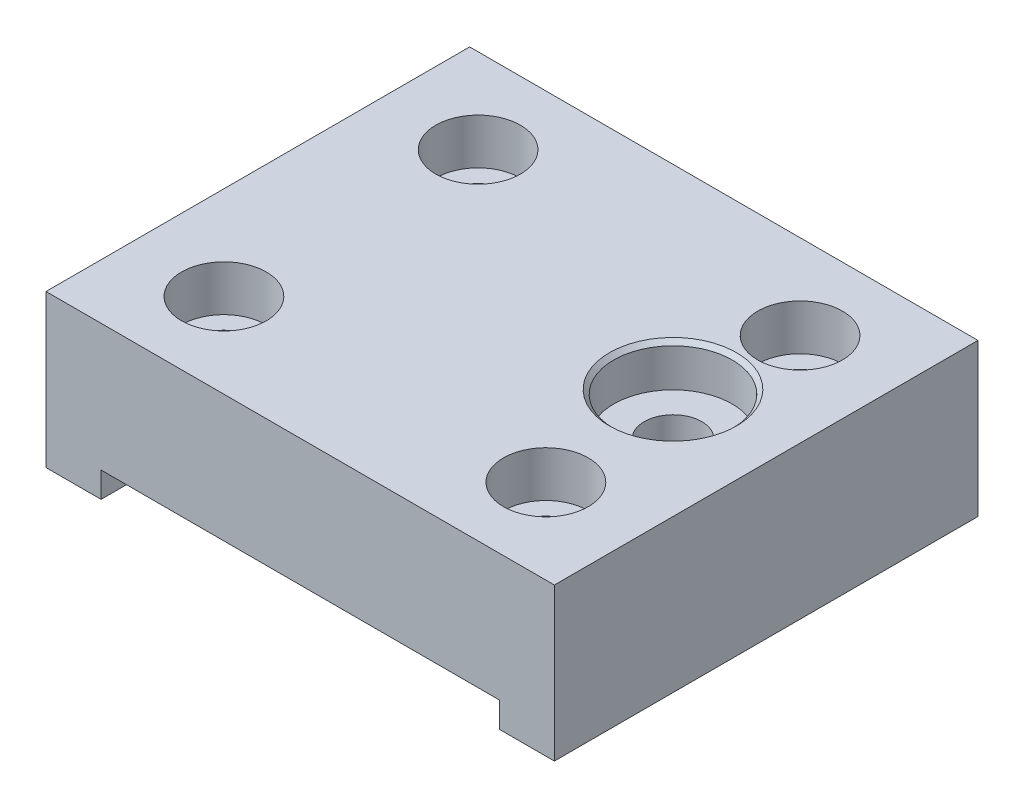
ISO-10303-21;
HEADER;
FILE_DESCRIPTION(('STEP AP214'),'2;1');
FILE_NAME('part.step','',(''),(''),'','','');
FILE_SCHEMA(('AUTOMOTIVE_DESIGN { 1 0 10303 214 1 1 1 1 }'));
ENDSEC;
DATA;
#1=APPLICATION_CONTEXT('core data for automotive mechanical design processes');
#2=APPLICATION_PROTOCOL_DEFINITION('international standard','automotive_design',2000,#1);
#3=PRODUCT_CONTEXT('',#1,'mechanical');
#4=PRODUCT('Part','Part','',(#3));
#5=PRODUCT_RELATED_PRODUCT_CATEGORY('part','',(#4));
#6=PRODUCT_DEFINITION_FORMATION('','',#4);
#7=PRODUCT_DEFINITION_CONTEXT('part definition',#1,'design');
#8=PRODUCT_DEFINITION('design','',#6,#7);
#9=PRODUCT_DEFINITION_SHAPE('','',#8);
#10=(LENGTH_UNIT() NAMED_UNIT(*) SI_UNIT(.MILLI.,.METRE.));
#11=(NAMED_UNIT(*) PLANE_ANGLE_UNIT() SI_UNIT($,.RADIAN.));
#12=(NAMED_UNIT(*) SI_UNIT($,.STERADIAN.) SOLID_ANGLE_UNIT());
#13=UNCERTAINTY_MEASURE_WITH_UNIT(LENGTH_MEASURE(1.E-05),#10,'distance_accuracy_value','');
#14=(GEOMETRIC_REPRESENTATION_CONTEXT(3) GLOBAL_UNCERTAINTY_ASSIGNED_CONTEXT((#13)) GLOBAL_UNIT_ASSIGNED_CONTEXT((#10,
#11,#12)) REPRESENTATION_CONTEXT('',''));
#15=CARTESIAN_POINT('',(0.,0.,0.));
#16=DIRECTION('',(0.,0.,1.));
#17=DIRECTION('',(1.,0.,0.));
#18=AXIS2_PLACEMENT_3D('',#15,#16,#17);
#19=CARTESIAN_POINT('',(17.,9.,-2.));
#20=DIRECTION('',(0.,1.,0.));
#21=DIRECTION('',(0.,0.,1.));
#22=AXIS2_PLACEMENT_3D('',#19,#20,#21);
#23=CYLINDRICAL_SURFACE('',#22,3.4);
#24=CARTESIAN_POINT('',(17.,-6.,-2.));
#25=DIRECTION('',(0.,1.,0.));
#26=DIRECTION('',(0.,0.,1.));
#27=AXIS2_PLACEMENT_3D('',#24,#25,#26);
#28=CIRCLE('',#27,3.4);
#29=CARTESIAN_POINT('',(17.,-6.,1.39999999999999));
#30=VERTEX_POINT('',#29);
#31=EDGE_CURVE('E229',#30,#30,#28,.T.);
#32=ORIENTED_EDGE('',*,*,#31,.F.);
#33=EDGE_LOOP('',(#32));
#34=FACE_BOUND('',#33,.T.);
#35=CARTESIAN_POINT('',(17.,4.,-2.));
#36=DIRECTION('',(0.,1.,0.));
#37=DIRECTION('',(0.,0.,1.));
#38=AXIS2_PLACEMENT_3D('',#35,#36,#37);
#39=CIRCLE('',#38,3.4);
#40=CARTESIAN_POINT('',(17.,4.,1.39999999999999));
#41=VERTEX_POINT('',#40);
#42=EDGE_CURVE('E234',#41,#41,#39,.F.);
#43=ORIENTED_EDGE('',*,*,#42,.F.);
#44=EDGE_LOOP('',(#43));
#45=FACE_BOUND('',#44,.T.);
#46=ADVANCED_FACE('F49',(#34,#45),#23,.F.);
#47=CARTESIAN_POINT('',(0.,-9.,0.));
#48=DIRECTION('',(0.,1.,0.));
#49=DIRECTION('',(0.,0.,1.));
#50=AXIS2_PLACEMENT_3D('',#47,#48,#49);
#51=PLANE('',#50);
#52=DIRECTION('',(-1.,0.,0.));
#53=VECTOR('',#52,1.);
#54=CARTESIAN_POINT('',(-30.,-9.,-25.));
#55=LINE('',#54,#53);
#56=CARTESIAN_POINT('',(-23.5,-9.,-25.));
#57=VERTEX_POINT('',#56);
#58=CARTESIAN_POINT('',(-30.,-9.,-25.));
#59=VERTEX_POINT('',#58);
#60=EDGE_CURVE('E178',#57,#59,#55,.T.);
#61=ORIENTED_EDGE('',*,*,#60,.F.);
#62=DIRECTION('',(0.,0.,1.));
#63=VECTOR('',#62,1.);
#64=CARTESIAN_POINT('',(-23.5,-9.,0.));
#65=LINE('',#64,#63);
#66=CARTESIAN_POINT('',(-23.5,-9.,25.));
#67=VERTEX_POINT('',#66);
#68=EDGE_CURVE('E203',#57,#67,#65,.T.);
#69=ORIENTED_EDGE('',*,*,#68,.T.);
#70=DIRECTION('',(1.,0.,0.));
#71=VECTOR('',#70,1.);
#72=CARTESIAN_POINT('',(-30.,-9.,25.));
#73=LINE('',#72,#71);
#74=CARTESIAN_POINT('',(-30.,-9.,25.));
#75=VERTEX_POINT('',#74);
#76=EDGE_CURVE('E166',#75,#67,#73,.T.);
#77=ORIENTED_EDGE('',*,*,#76,.F.);
#78=DIRECTION('',(0.,0.,1.));
#79=VECTOR('',#78,1.);
#80=CARTESIAN_POINT('',(-30.,-9.,-25.));
#81=LINE('',#80,#79);
#82=EDGE_CURVE('E181',#59,#75,#81,.T.);
#83=ORIENTED_EDGE('',*,*,#82,.F.);
#84=EDGE_LOOP('',(#61,#69,#77,#83));
#85=FACE_BOUND('',#84,.T.);
#86=ADVANCED_FACE('F254',(#85),#51,.F.);
#87=CARTESIAN_POINT('',(30.,9.,-25.));
#88=DIRECTION('',(-1.,0.,0.));
#89=DIRECTION('',(0.,0.,1.));
#90=AXIS2_PLACEMENT_3D('',#87,#88,#89);
#91=PLANE('',#90);
#92=DIRECTION('',(0.,0.,-1.));
#93=VECTOR('',#92,1.);
#94=CARTESIAN_POINT('',(30.,-9.,-25.));
#95=LINE('',#94,#93);
#96=CARTESIAN_POINT('',(30.,-9.,25.));
#97=VERTEX_POINT('',#96);
#98=CARTESIAN_POINT('',(30.,-9.,-25.));
#99=VERTEX_POINT('',#98);
#100=EDGE_CURVE('E161',#97,#99,#95,.T.);
#101=ORIENTED_EDGE('',*,*,#100,.T.);
#102=DIRECTION('',(0.,-1.,0.));
#103=VECTOR('',#102,1.);
#104=CARTESIAN_POINT('',(30.,9.,-25.));
#105=LINE('',#104,#103);
#106=CARTESIAN_POINT('',(30.,9.,-25.));
#107=VERTEX_POINT('',#106);
#108=EDGE_CURVE('E197',#107,#99,#105,.T.);
#109=ORIENTED_EDGE('',*,*,#108,.F.);
#110=DIRECTION('',(0.,0.,-1.));
#111=VECTOR('',#110,1.);
#112=CARTESIAN_POINT('',(30.,9.,-25.));
#113=LINE('',#112,#111);
#114=CARTESIAN_POINT('',(30.,9.,25.));
#115=VERTEX_POINT('',#114);
#116=EDGE_CURVE('E163',#115,#107,#113,.T.);
#117=ORIENTED_EDGE('',*,*,#116,.F.);
#118=DIRECTION('',(0.,-1.,0.));
#119=VECTOR('',#118,1.);
#120=CARTESIAN_POINT('',(30.,9.,25.));
#121=LINE('',#120,#119);
#122=EDGE_CURVE('E174',#115,#97,#121,.T.);
#123=ORIENTED_EDGE('',*,*,#122,.T.);
#124=EDGE_LOOP('',(#101,#109,#117,#123));
#125=FACE_BOUND('',#124,.T.);
#126=ADVANCED_FACE('F260',(#125),#91,.F.);
#127=CARTESIAN_POINT('',(-30.,9.,-25.));
#128=DIRECTION('',(0.,0.,1.));
#129=DIRECTION('',(1.,0.,0.));
#130=AXIS2_PLACEMENT_3D('',#127,#128,#129);
#131=PLANE('',#130);
#132=DIRECTION('',(-1.,0.,0.));
#133=VECTOR('',#132,1.);
#134=CARTESIAN_POINT('',(-23.5,-6.,-25.));
#135=LINE('',#134,#133);
#136=CARTESIAN_POINT('',(23.5,-6.,-25.));
#137=VERTEX_POINT('',#136);
#138=CARTESIAN_POINT('',(-23.5,-6.,-25.));
#139=VERTEX_POINT('',#138);
#140=EDGE_CURVE('E133',#137,#139,#135,.T.);
#141=ORIENTED_EDGE('',*,*,#140,.T.);
#142=DIRECTION('',(0.,-1.,0.));
#143=VECTOR('',#142,1.);
#144=CARTESIAN_POINT('',(-23.5,-6.,-25.));
#145=LINE('',#144,#143);
#146=EDGE_CURVE('E145',#139,#57,#145,.T.);
#147=ORIENTED_EDGE('',*,*,#146,.T.);
#148=ORIENTED_EDGE('',*,*,#60,.T.);
#149=DIRECTION('',(0.,-1.,0.));
#150=VECTOR('',#149,1.);
#151=CARTESIAN_POINT('',(-30.,9.,-25.));
#152=LINE('',#151,#150);
#153=CARTESIAN_POINT('',(-30.,9.,-25.));
#154=VERTEX_POINT('',#153);
#155=EDGE_CURVE('E193',#154,#59,#152,.T.);
#156=ORIENTED_EDGE('',*,*,#155,.F.);
#157=DIRECTION('',(-1.,0.,0.));
#158=VECTOR('',#157,1.);
#159=CARTESIAN_POINT('',(-30.,9.,-25.));
#160=LINE('',#159,#158);
#161=EDGE_CURVE('E104',#107,#154,#160,.T.);
#162=ORIENTED_EDGE('',*,*,#161,.F.);
#163=ORIENTED_EDGE('',*,*,#108,.T.);
#164=CARTESIAN_POINT('',(23.5,-9.,-25.));
#165=VERTEX_POINT('',#164);
#166=EDGE_CURVE('E143',#99,#165,#55,.T.);
#167=ORIENTED_EDGE('',*,*,#166,.T.);
#168=DIRECTION('',(0.,1.,0.));
#169=VECTOR('',#168,1.);
#170=CARTESIAN_POINT('',(23.5,-6.,-25.));
#171=LINE('',#170,#169);
#172=EDGE_CURVE('E66',#165,#137,#171,.T.);
#173=ORIENTED_EDGE('',*,*,#172,.T.);
#174=EDGE_LOOP('',(#141,#147,#148,#156,#162,#163,#167,#173));
#175=FACE_BOUND('',#174,.T.);
#176=ADVANCED_FACE('F142',(#175),#131,.F.);
#177=CARTESIAN_POINT('',(-30.,9.,-25.));
#178=DIRECTION('',(1.,0.,0.));
#179=DIRECTION('',(0.,0.,-1.));
#180=AXIS2_PLACEMENT_3D('',#177,#178,#179);
#181=PLANE('',#180);
#182=ORIENTED_EDGE('',*,*,#82,.T.);
#183=DIRECTION('',(0.,-1.,0.));
#184=VECTOR('',#183,1.);
#185=CARTESIAN_POINT('',(-30.,9.,25.));
#186=LINE('',#185,#184);
#187=CARTESIAN_POINT('',(-30.,9.,25.));
#188=VERTEX_POINT('',#187);
#189=EDGE_CURVE('E189',#188,#75,#186,.T.);
#190=ORIENTED_EDGE('',*,*,#189,.F.);
#191=DIRECTION('',(0.,0.,1.));
#192=VECTOR('',#191,1.);
#193=CARTESIAN_POINT('',(-30.,9.,-25.));
#194=LINE('',#193,#192);
#195=EDGE_CURVE('E169',#154,#188,#194,.T.);
#196=ORIENTED_EDGE('',*,*,#195,.F.);
#197=ORIENTED_EDGE('',*,*,#155,.T.);
#198=EDGE_LOOP('',(#182,#190,#196,#197));
#199=FACE_BOUND('',#198,.T.);
#200=ADVANCED_FACE('F334',(#199),#181,.F.);
#201=CARTESIAN_POINT('',(-30.,9.,25.));
#202=DIRECTION('',(0.,0.,-1.));
#203=DIRECTION('',(-1.,0.,0.));
#204=AXIS2_PLACEMENT_3D('',#201,#202,#203);
#205=PLANE('',#204);
#206=ORIENTED_EDGE('',*,*,#76,.T.);
#207=DIRECTION('',(0.,-1.,0.));
#208=VECTOR('',#207,1.);
#209=CARTESIAN_POINT('',(-23.5,-6.,25.));
#210=LINE('',#209,#208);
#211=CARTESIAN_POINT('',(-23.5,-6.,25.));
#212=VERTEX_POINT('',#211);
#213=EDGE_CURVE('E152',#212,#67,#210,.T.);
#214=ORIENTED_EDGE('',*,*,#213,.F.);
#215=DIRECTION('',(-1.,0.,0.));
#216=VECTOR('',#215,1.);
#217=CARTESIAN_POINT('',(-23.5,-6.,25.));
#218=LINE('',#217,#216);
#219=CARTESIAN_POINT('',(23.5,-6.,25.));
#220=VERTEX_POINT('',#219);
#221=EDGE_CURVE('E148',#220,#212,#218,.T.);
#222=ORIENTED_EDGE('',*,*,#221,.F.);
#223=DIRECTION('',(0.,1.,0.));
#224=VECTOR('',#223,1.);
#225=CARTESIAN_POINT('',(23.5,-6.,25.));
#226=LINE('',#225,#224);
#227=CARTESIAN_POINT('',(23.5,-9.,25.));
#228=VERTEX_POINT('',#227);
#229=EDGE_CURVE('E127',#228,#220,#226,.T.);
#230=ORIENTED_EDGE('',*,*,#229,.F.);
#231=EDGE_CURVE('E96',#228,#97,#73,.T.);
#232=ORIENTED_EDGE('',*,*,#231,.T.);
#233=ORIENTED_EDGE('',*,*,#122,.F.);
#234=DIRECTION('',(1.,0.,0.));
#235=VECTOR('',#234,1.);
#236=CARTESIAN_POINT('',(-30.,9.,25.));
#237=LINE('',#236,#235);
#238=EDGE_CURVE('E75',#188,#115,#237,.T.);
#239=ORIENTED_EDGE('',*,*,#238,.F.);
#240=ORIENTED_EDGE('',*,*,#189,.T.);
#241=EDGE_LOOP('',(#206,#214,#222,#230,#232,#233,#239,#240));
#242=FACE_BOUND('',#241,.T.);
#243=ADVANCED_FACE('F327',(#242),#205,.F.);
#244=CARTESIAN_POINT('',(0.,9.,0.));
#245=DIRECTION('',(0.,1.,0.));
#246=DIRECTION('',(0.,0.,1.));
#247=AXIS2_PLACEMENT_3D('',#244,#245,#246);
#248=PLANE('',#247);
#249=CARTESIAN_POINT('',(17.,9.,-2.));
#250=DIRECTION('',(0.,1.,0.));
#251=DIRECTION('',(0.,0.,1.));
#252=AXIS2_PLACEMENT_3D('',#249,#250,#251);
#253=CIRCLE('',#252,7.5);
#254=CARTESIAN_POINT('',(17.,9.,5.5));
#255=VERTEX_POINT('',#254);
#256=EDGE_CURVE('E11',#255,#255,#253,.F.);
#257=ORIENTED_EDGE('',*,*,#256,.T.);
#258=EDGE_LOOP('',(#257));
#259=FACE_BOUND('',#258,.T.);
#260=CARTESIAN_POINT('',(-19.,9.,-15.));
#261=DIRECTION('',(0.,1.,0.));
#262=DIRECTION('',(0.,0.,1.));
#263=AXIS2_PLACEMENT_3D('',#260,#261,#262);
#264=CIRCLE('',#263,4.99999999999999);
#265=CARTESIAN_POINT('',(-19.,9.,-10.));
#266=VERTEX_POINT('',#265);
#267=EDGE_CURVE('E233',#266,#266,#264,.T.);
#268=ORIENTED_EDGE('',*,*,#267,.F.);
#269=EDGE_LOOP('',(#268));
#270=FACE_BOUND('',#269,.T.);
#271=CARTESIAN_POINT('',(19.,9.,-15.));
#272=DIRECTION('',(0.,1.,0.));
#273=DIRECTION('',(0.,0.,1.));
#274=AXIS2_PLACEMENT_3D('',#271,#272,#273);
#275=CIRCLE('',#274,4.99999999999999);
#276=CARTESIAN_POINT('',(19.,9.,-10.));
#277=VERTEX_POINT('',#276);
#278=EDGE_CURVE('E227',#277,#277,#275,.T.);
#279=ORIENTED_EDGE('',*,*,#278,.F.);
#280=EDGE_LOOP('',(#279));
#281=FACE_BOUND('',#280,.T.);
#282=CARTESIAN_POINT('',(19.,9.,15.));
#283=DIRECTION('',(0.,1.,0.));
#284=DIRECTION('',(0.,0.,1.));
#285=AXIS2_PLACEMENT_3D('',#282,#283,#284);
#286=CIRCLE('',#285,4.99999999999999);
#287=CARTESIAN_POINT('',(19.,9.,20.));
#288=VERTEX_POINT('',#287);
#289=EDGE_CURVE('E221',#288,#288,#286,.T.);
#290=ORIENTED_EDGE('',*,*,#289,.F.);
#291=EDGE_LOOP('',(#290));
#292=FACE_BOUND('',#291,.T.);
#293=CARTESIAN_POINT('',(-19.,9.,15.));
#294=DIRECTION('',(0.,1.,0.));
#295=DIRECTION('',(0.,0.,1.));
#296=AXIS2_PLACEMENT_3D('',#293,#294,#295);
#297=CIRCLE('',#296,4.99999999999999);
#298=CARTESIAN_POINT('',(-19.,9.,20.));
#299=VERTEX_POINT('',#298);
#300=EDGE_CURVE('E215',#299,#299,#297,.T.);
#301=ORIENTED_EDGE('',*,*,#300,.F.);
#302=EDGE_LOOP('',(#301));
#303=FACE_BOUND('',#302,.T.);
#304=ORIENTED_EDGE('',*,*,#116,.T.);
#305=ORIENTED_EDGE('',*,*,#161,.T.);
#306=ORIENTED_EDGE('',*,*,#195,.T.);
#307=ORIENTED_EDGE('',*,*,#238,.T.);
#308=EDGE_LOOP('',(#304,#305,#306,#307));
#309=FACE_BOUND('',#308,.T.);
#310=ADVANCED_FACE('F325',(#259,#270,#281,#292,#303,#309),#248,.T.);
#311=ORIENTED_EDGE('',*,*,#231,.F.);
#312=DIRECTION('',(0.,0.,-1.));
#313=VECTOR('',#312,1.);
#314=CARTESIAN_POINT('',(23.5,-9.,0.));
#315=LINE('',#314,#313);
#316=EDGE_CURVE('E200',#228,#165,#315,.T.);
#317=ORIENTED_EDGE('',*,*,#316,.T.);
#318=ORIENTED_EDGE('',*,*,#166,.F.);
#319=ORIENTED_EDGE('',*,*,#100,.F.);
#320=EDGE_LOOP('',(#311,#317,#318,#319));
#321=FACE_BOUND('',#320,.T.);
#322=ADVANCED_FACE('F263',(#321),#51,.F.);
#323=CARTESIAN_POINT('',(-23.5,-6.,-25.));
#324=DIRECTION('',(-1.,0.,0.));
#325=DIRECTION('',(0.,0.,1.));
#326=AXIS2_PLACEMENT_3D('',#323,#324,#325);
#327=PLANE('',#326);
#328=ORIENTED_EDGE('',*,*,#146,.F.);
#329=DIRECTION('',(0.,0.,1.));
#330=VECTOR('',#329,1.);
#331=CARTESIAN_POINT('',(-23.5,-6.,-25.));
#332=LINE('',#331,#330);
#333=EDGE_CURVE('E132',#139,#212,#332,.T.);
#334=ORIENTED_EDGE('',*,*,#333,.T.);
#335=ORIENTED_EDGE('',*,*,#213,.T.);
#336=ORIENTED_EDGE('',*,*,#68,.F.);
#337=EDGE_LOOP('',(#328,#334,#335,#336));
#338=FACE_BOUND('',#337,.T.);
#339=ADVANCED_FACE('F321',(#338),#327,.F.);
#340=CARTESIAN_POINT('',(23.5,-6.,-25.));
#341=DIRECTION('',(1.,0.,0.));
#342=DIRECTION('',(0.,0.,-1.));
#343=AXIS2_PLACEMENT_3D('',#340,#341,#342);
#344=PLANE('',#343);
#345=ORIENTED_EDGE('',*,*,#229,.T.);
#346=DIRECTION('',(0.,0.,1.));
#347=VECTOR('',#346,1.);
#348=CARTESIAN_POINT('',(23.5,-6.,-25.));
#349=LINE('',#348,#347);
#350=EDGE_CURVE('E124',#137,#220,#349,.T.);
#351=ORIENTED_EDGE('',*,*,#350,.F.);
#352=ORIENTED_EDGE('',*,*,#172,.F.);
#353=ORIENTED_EDGE('',*,*,#316,.F.);
#354=EDGE_LOOP('',(#345,#351,#352,#353));
#355=FACE_BOUND('',#354,.T.);
#356=ADVANCED_FACE('F126',(#355),#344,.F.);
#357=CARTESIAN_POINT('',(-23.5,-6.,-25.));
#358=DIRECTION('',(0.,1.,0.));
#359=DIRECTION('',(0.,0.,1.));
#360=AXIS2_PLACEMENT_3D('',#357,#358,#359);
#361=PLANE('',#360);
#362=ORIENTED_EDGE('',*,*,#31,.T.);
#363=EDGE_LOOP('',(#362));
#364=FACE_BOUND('',#363,.T.);
#365=CARTESIAN_POINT('',(-19.,-6.,-15.));
#366=DIRECTION('',(0.,1.,0.));
#367=DIRECTION('',(0.,0.,1.));
#368=AXIS2_PLACEMENT_3D('',#365,#366,#367);
#369=CIRCLE('',#368,2.75);
#370=CARTESIAN_POINT('',(-19.,-6.,-12.25));
#371=VERTEX_POINT('',#370);
#372=EDGE_CURVE('E223',#371,#371,#369,.T.);
#373=ORIENTED_EDGE('',*,*,#372,.T.);
#374=EDGE_LOOP('',(#373));
#375=FACE_BOUND('',#374,.T.);
#376=CARTESIAN_POINT('',(19.,-6.,-15.));
#377=DIRECTION('',(0.,1.,0.));
#378=DIRECTION('',(0.,0.,1.));
#379=AXIS2_PLACEMENT_3D('',#376,#377,#378);
#380=CIRCLE('',#379,2.75);
#381=CARTESIAN_POINT('',(19.,-6.,-12.25));
#382=VERTEX_POINT('',#381);
#383=EDGE_CURVE('E217',#382,#382,#380,.T.);
#384=ORIENTED_EDGE('',*,*,#383,.T.);
#385=EDGE_LOOP('',(#384));
#386=FACE_BOUND('',#385,.T.);
#387=CARTESIAN_POINT('',(19.,-6.,15.));
#388=DIRECTION('',(0.,1.,0.));
#389=DIRECTION('',(0.,0.,1.));
#390=AXIS2_PLACEMENT_3D('',#387,#388,#389);
#391=CIRCLE('',#390,2.75);
#392=CARTESIAN_POINT('',(19.,-6.,17.75));
#393=VERTEX_POINT('',#392);
#394=EDGE_CURVE('E211',#393,#393,#391,.T.);
#395=ORIENTED_EDGE('',*,*,#394,.T.);
#396=EDGE_LOOP('',(#395));
#397=FACE_BOUND('',#396,.T.);
#398=CARTESIAN_POINT('',(-19.,-6.,15.));
#399=DIRECTION('',(0.,1.,0.));
#400=DIRECTION('',(0.,0.,1.));
#401=AXIS2_PLACEMENT_3D('',#398,#399,#400);
#402=CIRCLE('',#401,2.75);
#403=CARTESIAN_POINT('',(-19.,-6.,17.75));
#404=VERTEX_POINT('',#403);
#405=EDGE_CURVE('E155',#404,#404,#402,.T.);
#406=ORIENTED_EDGE('',*,*,#405,.T.);
#407=EDGE_LOOP('',(#406));
#408=FACE_BOUND('',#407,.T.);
#409=ORIENTED_EDGE('',*,*,#221,.T.);
#410=ORIENTED_EDGE('',*,*,#333,.F.);
#411=ORIENTED_EDGE('',*,*,#140,.F.);
#412=ORIENTED_EDGE('',*,*,#350,.T.);
#413=EDGE_LOOP('',(#409,#410,#411,#412));
#414=FACE_BOUND('',#413,.T.);
#415=ADVANCED_FACE('F136',(#364,#375,#386,#397,#408,#414),#361,.F.);
#416=CARTESIAN_POINT('',(-19.,9.,15.));
#417=DIRECTION('',(0.,1.,0.));
#418=DIRECTION('',(0.,0.,1.));
#419=AXIS2_PLACEMENT_3D('',#416,#417,#418);
#420=CYLINDRICAL_SURFACE('',#419,2.75);
#421=CARTESIAN_POINT('',(-19.,3.6,15.));
#422=DIRECTION('',(0.,1.,0.));
#423=DIRECTION('',(0.,0.,1.));
#424=AXIS2_PLACEMENT_3D('',#421,#422,#423);
#425=CIRCLE('',#424,2.75);
#426=CARTESIAN_POINT('',(-19.,3.6,17.75));
#427=VERTEX_POINT('',#426);
#428=EDGE_CURVE('E210',#427,#427,#425,.T.);
#429=ORIENTED_EDGE('',*,*,#428,.T.);
#430=EDGE_LOOP('',(#429));
#431=FACE_BOUND('',#430,.T.);
#432=ORIENTED_EDGE('',*,*,#405,.F.);
#433=EDGE_LOOP('',(#432));
#434=FACE_BOUND('',#433,.T.);
#435=ADVANCED_FACE('F311',(#431,#434),#420,.F.);
#436=CARTESIAN_POINT('',(-16.25,3.6,15.));
#437=DIRECTION('',(0.,-1.,0.));
#438=DIRECTION('',(0.,0.,-1.));
#439=AXIS2_PLACEMENT_3D('',#436,#437,#438);
#440=PLANE('',#439);
#441=ORIENTED_EDGE('',*,*,#428,.F.);
#442=EDGE_LOOP('',(#441));
#443=FACE_BOUND('',#442,.T.);
#444=CARTESIAN_POINT('',(-19.,3.6,15.));
#445=DIRECTION('',(0.,1.,0.));
#446=DIRECTION('',(0.,0.,1.));
#447=AXIS2_PLACEMENT_3D('',#444,#445,#446);
#448=CIRCLE('',#447,5.);
#449=CARTESIAN_POINT('',(-19.,3.6,20.));
#450=VERTEX_POINT('',#449);
#451=EDGE_CURVE('E608',#450,#450,#448,.T.);
#452=ORIENTED_EDGE('',*,*,#451,.T.);
#453=EDGE_LOOP('',(#452));
#454=FACE_BOUND('',#453,.T.);
#455=ADVANCED_FACE('F307',(#443,#454),#440,.F.);
#456=CARTESIAN_POINT('',(-19.,9.,15.));
#457=DIRECTION('',(0.,1.,0.));
#458=DIRECTION('',(0.,0.,1.));
#459=AXIS2_PLACEMENT_3D('',#456,#457,#458);
#460=CYLINDRICAL_SURFACE('',#459,4.99999999999999);
#461=ORIENTED_EDGE('',*,*,#451,.F.);
#462=EDGE_LOOP('',(#461));
#463=FACE_BOUND('',#462,.T.);
#464=ORIENTED_EDGE('',*,*,#300,.T.);
#465=EDGE_LOOP('',(#464));
#466=FACE_BOUND('',#465,.T.);
#467=ADVANCED_FACE('F303',(#463,#466),#460,.F.);
#468=CARTESIAN_POINT('',(19.,9.,15.));
#469=DIRECTION('',(0.,1.,0.));
#470=DIRECTION('',(0.,0.,1.));
#471=AXIS2_PLACEMENT_3D('',#468,#469,#470);
#472=CYLINDRICAL_SURFACE('',#471,2.75);
#473=CARTESIAN_POINT('',(19.,3.6,15.));
#474=DIRECTION('',(0.,1.,0.));
#475=DIRECTION('',(0.,0.,1.));
#476=AXIS2_PLACEMENT_3D('',#473,#474,#475);
#477=CIRCLE('',#476,2.75);
#478=CARTESIAN_POINT('',(19.,3.6,17.75));
#479=VERTEX_POINT('',#478);
#480=EDGE_CURVE('E216',#479,#479,#477,.T.);
#481=ORIENTED_EDGE('',*,*,#480,.T.);
#482=EDGE_LOOP('',(#481));
#483=FACE_BOUND('',#482,.T.);
#484=ORIENTED_EDGE('',*,*,#394,.F.);
#485=EDGE_LOOP('',(#484));
#486=FACE_BOUND('',#485,.T.);
#487=ADVANCED_FACE('F299',(#483,#486),#472,.F.);
#488=CARTESIAN_POINT('',(21.75,3.6,15.));
#489=DIRECTION('',(0.,-1.,0.));
#490=DIRECTION('',(0.,0.,-1.));
#491=AXIS2_PLACEMENT_3D('',#488,#489,#490);
#492=PLANE('',#491);
#493=ORIENTED_EDGE('',*,*,#480,.F.);
#494=EDGE_LOOP('',(#493));
#495=FACE_BOUND('',#494,.T.);
#496=CARTESIAN_POINT('',(19.,3.6,15.));
#497=DIRECTION('',(0.,1.,0.));
#498=DIRECTION('',(0.,0.,1.));
#499=AXIS2_PLACEMENT_3D('',#496,#497,#498);
#500=CIRCLE('',#499,5.);
#501=CARTESIAN_POINT('',(19.,3.6,20.));
#502=VERTEX_POINT('',#501);
#503=EDGE_CURVE('E598',#502,#502,#500,.T.);
#504=ORIENTED_EDGE('',*,*,#503,.T.);
#505=EDGE_LOOP('',(#504));
#506=FACE_BOUND('',#505,.T.);
#507=ADVANCED_FACE('F295',(#495,#506),#492,.F.);
#508=CARTESIAN_POINT('',(19.,9.,15.));
#509=DIRECTION('',(0.,1.,0.));
#510=DIRECTION('',(0.,0.,1.));
#511=AXIS2_PLACEMENT_3D('',#508,#509,#510);
#512=CYLINDRICAL_SURFACE('',#511,5.);
#513=ORIENTED_EDGE('',*,*,#503,.F.);
#514=EDGE_LOOP('',(#513));
#515=FACE_BOUND('',#514,.T.);
#516=ORIENTED_EDGE('',*,*,#289,.T.);
#517=EDGE_LOOP('',(#516));
#518=FACE_BOUND('',#517,.T.);
#519=ADVANCED_FACE('F291',(#515,#518),#512,.F.);
#520=CARTESIAN_POINT('',(19.,9.,-15.));
#521=DIRECTION('',(0.,1.,0.));
#522=DIRECTION('',(0.,0.,1.));
#523=AXIS2_PLACEMENT_3D('',#520,#521,#522);
#524=CYLINDRICAL_SURFACE('',#523,2.75);
#525=CARTESIAN_POINT('',(19.,3.6,-15.));
#526=DIRECTION('',(0.,1.,0.));
#527=DIRECTION('',(0.,0.,1.));
#528=AXIS2_PLACEMENT_3D('',#525,#526,#527);
#529=CIRCLE('',#528,2.75);
#530=CARTESIAN_POINT('',(19.,3.6,-12.25));
#531=VERTEX_POINT('',#530);
#532=EDGE_CURVE('E222',#531,#531,#529,.T.);
#533=ORIENTED_EDGE('',*,*,#532,.T.);
#534=EDGE_LOOP('',(#533));
#535=FACE_BOUND('',#534,.T.);
#536=ORIENTED_EDGE('',*,*,#383,.F.);
#537=EDGE_LOOP('',(#536));
#538=FACE_BOUND('',#537,.T.);
#539=ADVANCED_FACE('F287',(#535,#538),#524,.F.);
#540=CARTESIAN_POINT('',(21.75,3.6,-15.));
#541=DIRECTION('',(0.,-1.,0.));
#542=DIRECTION('',(0.,0.,-1.));
#543=AXIS2_PLACEMENT_3D('',#540,#541,#542);
#544=PLANE('',#543);
#545=ORIENTED_EDGE('',*,*,#532,.F.);
#546=EDGE_LOOP('',(#545));
#547=FACE_BOUND('',#546,.T.);
#548=CARTESIAN_POINT('',(19.,3.6,-15.));
#549=DIRECTION('',(0.,1.,0.));
#550=DIRECTION('',(0.,0.,1.));
#551=AXIS2_PLACEMENT_3D('',#548,#549,#550);
#552=CIRCLE('',#551,5.);
#553=CARTESIAN_POINT('',(19.,3.6,-10.));
#554=VERTEX_POINT('',#553);
#555=EDGE_CURVE('E588',#554,#554,#552,.T.);
#556=ORIENTED_EDGE('',*,*,#555,.T.);
#557=EDGE_LOOP('',(#556));
#558=FACE_BOUND('',#557,.T.);
#559=ADVANCED_FACE('F283',(#547,#558),#544,.F.);
#560=CARTESIAN_POINT('',(19.,9.,-15.));
#561=DIRECTION('',(0.,1.,0.));
#562=DIRECTION('',(0.,0.,1.));
#563=AXIS2_PLACEMENT_3D('',#560,#561,#562);
#564=CYLINDRICAL_SURFACE('',#563,5.);
#565=ORIENTED_EDGE('',*,*,#555,.F.);
#566=EDGE_LOOP('',(#565));
#567=FACE_BOUND('',#566,.T.);
#568=ORIENTED_EDGE('',*,*,#278,.T.);
#569=EDGE_LOOP('',(#568));
#570=FACE_BOUND('',#569,.T.);
#571=ADVANCED_FACE('F279',(#567,#570),#564,.F.);
#572=CARTESIAN_POINT('',(-19.,9.,-15.));
#573=DIRECTION('',(0.,1.,0.));
#574=DIRECTION('',(0.,0.,1.));
#575=AXIS2_PLACEMENT_3D('',#572,#573,#574);
#576=CYLINDRICAL_SURFACE('',#575,2.75);
#577=CARTESIAN_POINT('',(-19.,3.6,-15.));
#578=DIRECTION('',(0.,1.,0.));
#579=DIRECTION('',(0.,0.,1.));
#580=AXIS2_PLACEMENT_3D('',#577,#578,#579);
#581=CIRCLE('',#580,2.75);
#582=CARTESIAN_POINT('',(-19.,3.6,-12.25));
#583=VERTEX_POINT('',#582);
#584=EDGE_CURVE('E228',#583,#583,#581,.T.);
#585=ORIENTED_EDGE('',*,*,#584,.T.);
#586=EDGE_LOOP('',(#585));
#587=FACE_BOUND('',#586,.T.);
#588=ORIENTED_EDGE('',*,*,#372,.F.);
#589=EDGE_LOOP('',(#588));
#590=FACE_BOUND('',#589,.T.);
#591=ADVANCED_FACE('F275',(#587,#590),#576,.F.);
#592=CARTESIAN_POINT('',(-16.25,3.6,-15.));
#593=DIRECTION('',(0.,-1.,0.));
#594=DIRECTION('',(0.,0.,-1.));
#595=AXIS2_PLACEMENT_3D('',#592,#593,#594);
#596=PLANE('',#595);
#597=ORIENTED_EDGE('',*,*,#584,.F.);
#598=EDGE_LOOP('',(#597));
#599=FACE_BOUND('',#598,.T.);
#600=CARTESIAN_POINT('',(-19.,3.6,-15.));
#601=DIRECTION('',(0.,1.,0.));
#602=DIRECTION('',(0.,0.,1.));
#603=AXIS2_PLACEMENT_3D('',#600,#601,#602);
#604=CIRCLE('',#603,5.);
#605=CARTESIAN_POINT('',(-19.,3.6,-10.));
#606=VERTEX_POINT('',#605);
#607=EDGE_CURVE('E578',#606,#606,#604,.T.);
#608=ORIENTED_EDGE('',*,*,#607,.T.);
#609=EDGE_LOOP('',(#608));
#610=FACE_BOUND('',#609,.T.);
#611=ADVANCED_FACE('F271',(#599,#610),#596,.F.);
#612=CARTESIAN_POINT('',(-19.,9.,-15.));
#613=DIRECTION('',(0.,1.,0.));
#614=DIRECTION('',(0.,0.,1.));
#615=AXIS2_PLACEMENT_3D('',#612,#613,#614);
#616=CYLINDRICAL_SURFACE('',#615,4.99999999999999);
#617=ORIENTED_EDGE('',*,*,#607,.F.);
#618=EDGE_LOOP('',(#617));
#619=FACE_BOUND('',#618,.T.);
#620=ORIENTED_EDGE('',*,*,#267,.T.);
#621=EDGE_LOOP('',(#620));
#622=FACE_BOUND('',#621,.T.);
#623=ADVANCED_FACE('F268',(#619,#622),#616,.F.);
#624=CARTESIAN_POINT('',(17.,4.,-2.));
#625=DIRECTION('',(0.,1.,0.));
#626=DIRECTION('',(0.,0.,1.));
#627=AXIS2_PLACEMENT_3D('',#624,#625,#626);
#628=PLANE('',#627);
#629=CARTESIAN_POINT('',(17.,4.,-2.));
#630=DIRECTION('',(0.,1.,0.));
#631=DIRECTION('',(0.,0.,1.));
#632=AXIS2_PLACEMENT_3D('',#629,#630,#631);
#633=CIRCLE('',#632,7.);
#634=CARTESIAN_POINT('',(17.,4.,5.));
#635=VERTEX_POINT('',#634);
#636=EDGE_CURVE('E237',#635,#635,#633,.T.);
#637=ORIENTED_EDGE('',*,*,#636,.T.);
#638=EDGE_LOOP('',(#637));
#639=FACE_BOUND('',#638,.T.);
#640=ORIENTED_EDGE('',*,*,#42,.T.);
#641=EDGE_LOOP('',(#640));
#642=FACE_BOUND('',#641,.T.);
#643=ADVANCED_FACE('F250',(#639,#642),#628,.T.);
#644=CARTESIAN_POINT('',(17.,4.,-2.));
#645=DIRECTION('',(0.,1.,0.));
#646=DIRECTION('',(0.,0.,1.));
#647=AXIS2_PLACEMENT_3D('',#644,#645,#646);
#648=CYLINDRICAL_SURFACE('',#647,7.);
#649=CARTESIAN_POINT('',(17.,8.5,-2.));
#650=DIRECTION('',(0.,1.,0.));
#651=DIRECTION('',(0.,0.,1.));
#652=AXIS2_PLACEMENT_3D('',#649,#650,#651);
#653=CIRCLE('',#652,7.);
#654=CARTESIAN_POINT('',(17.,8.5,5.));
#655=VERTEX_POINT('',#654);
#656=EDGE_CURVE('E59',#655,#655,#653,.T.);
#657=ORIENTED_EDGE('',*,*,#656,.T.);
#658=EDGE_LOOP('',(#657));
#659=FACE_BOUND('',#658,.T.);
#660=ORIENTED_EDGE('',*,*,#636,.F.);
#661=EDGE_LOOP('',(#660));
#662=FACE_BOUND('',#661,.T.);
#663=ADVANCED_FACE('F242',(#659,#662),#648,.F.);
#664=CARTESIAN_POINT('',(17.,8.5,-2.));
#665=DIRECTION('',(0.,1.,0.));
#666=DIRECTION('',(0.,0.,1.));
#667=AXIS2_PLACEMENT_3D('',#664,#665,#666);
#668=CONICAL_SURFACE('',#667,7.,0.785398163397451);
#669=ORIENTED_EDGE('',*,*,#256,.F.);
#670=EDGE_LOOP('',(#669));
#671=FACE_BOUND('',#670,.T.);
#672=ORIENTED_EDGE('',*,*,#656,.F.);
#673=EDGE_LOOP('',(#672));
#674=FACE_BOUND('',#673,.T.);
#675=ADVANCED_FACE('F52',(#671,#674),#668,.F.);
#676=CLOSED_SHELL('',(#46,#86,#126,#176,#200,#243,#310,#322,#339,#356,#415,#435,#455,#467,#487,
#507,#519,#539,#559,#571,#591,#611,#623,#643,#663,#675));
#677=MANIFOLD_SOLID_BREP('B2',#676);
#678=ADVANCED_BREP_SHAPE_REPRESENTATION('',(#18,#677),#14);
#679=SHAPE_DEFINITION_REPRESENTATION(#9,#678);
ENDSEC;
END-ISO-10303-21;
